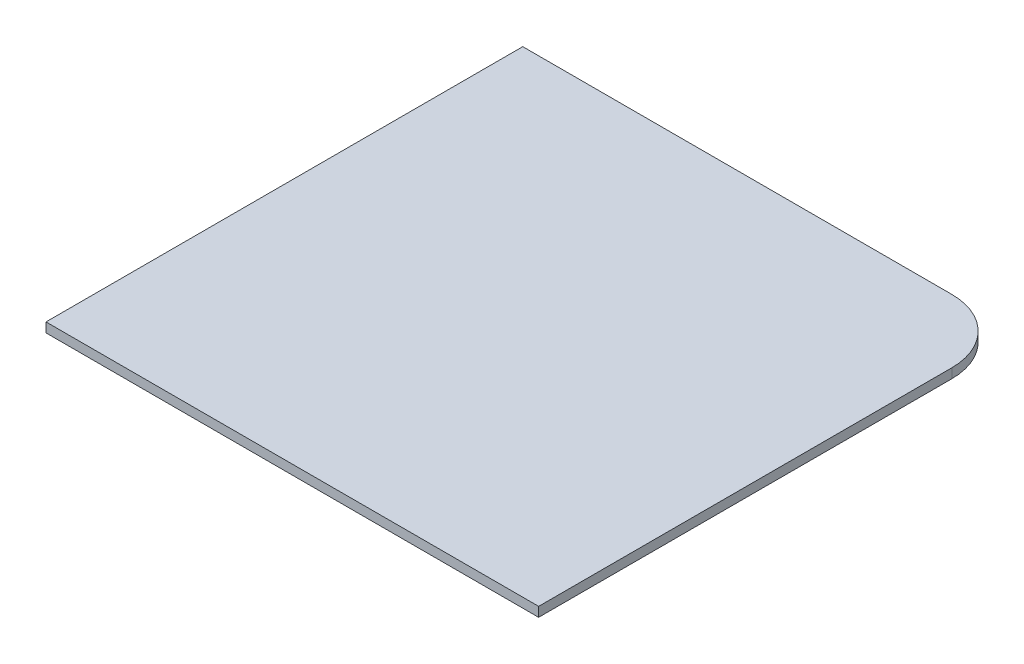
ISO-10303-21;
HEADER;
FILE_DESCRIPTION(('STEP AP214'),'2;1');
FILE_NAME('part.step','',(''),(''),'','','');
FILE_SCHEMA(('AUTOMOTIVE_DESIGN { 1 0 10303 214 1 1 1 1 }'));
ENDSEC;
DATA;
#1=APPLICATION_CONTEXT('core data for automotive mechanical design processes');
#2=APPLICATION_PROTOCOL_DEFINITION('international standard','automotive_design',2000,#1);
#3=PRODUCT_CONTEXT('',#1,'mechanical');
#4=PRODUCT('Part','Part','',(#3));
#5=PRODUCT_RELATED_PRODUCT_CATEGORY('part','',(#4));
#6=PRODUCT_DEFINITION_FORMATION('','',#4);
#7=PRODUCT_DEFINITION_CONTEXT('part definition',#1,'design');
#8=PRODUCT_DEFINITION('design','',#6,#7);
#9=PRODUCT_DEFINITION_SHAPE('','',#8);
#10=(LENGTH_UNIT() NAMED_UNIT(*) SI_UNIT(.MILLI.,.METRE.));
#11=(NAMED_UNIT(*) PLANE_ANGLE_UNIT() SI_UNIT($,.RADIAN.));
#12=(NAMED_UNIT(*) SI_UNIT($,.STERADIAN.) SOLID_ANGLE_UNIT());
#13=UNCERTAINTY_MEASURE_WITH_UNIT(LENGTH_MEASURE(1.E-05),#10,'distance_accuracy_value','');
#14=(GEOMETRIC_REPRESENTATION_CONTEXT(3) GLOBAL_UNCERTAINTY_ASSIGNED_CONTEXT((#13)) GLOBAL_UNIT_ASSIGNED_CONTEXT((#10,
#11,#12)) REPRESENTATION_CONTEXT('',''));
#15=CARTESIAN_POINT('',(0.,0.,0.));
#16=DIRECTION('',(0.,0.,1.));
#17=DIRECTION('',(1.,0.,0.));
#18=AXIS2_PLACEMENT_3D('',#15,#16,#17);
#19=CARTESIAN_POINT('',(57.5,3.,-75.));
#20=DIRECTION('',(0.,0.,1.));
#21=DIRECTION('',(1.,0.,0.));
#22=AXIS2_PLACEMENT_3D('',#19,#20,#21);
#23=PLANE('',#22);
#24=DIRECTION('',(-1.,0.,0.));
#25=VECTOR('',#24,1.);
#26=CARTESIAN_POINT('',(57.5,0.,-75.));
#27=LINE('',#26,#25);
#28=CARTESIAN_POINT('',(57.5,0.,-75.));
#29=VERTEX_POINT('',#28);
#30=CARTESIAN_POINT('',(-77.5,0.,-75.));
#31=VERTEX_POINT('',#30);
#32=EDGE_CURVE('E122',#29,#31,#27,.T.);
#33=ORIENTED_EDGE('',*,*,#32,.T.);
#34=DIRECTION('',(0.,-1.,0.));
#35=VECTOR('',#34,1.);
#36=CARTESIAN_POINT('',(-77.5,3.,-75.));
#37=LINE('',#36,#35);
#38=CARTESIAN_POINT('',(-77.5,3.,-75.));
#39=VERTEX_POINT('',#38);
#40=EDGE_CURVE('E11',#39,#31,#37,.T.);
#41=ORIENTED_EDGE('',*,*,#40,.F.);
#42=DIRECTION('',(-1.,0.,0.));
#43=VECTOR('',#42,1.);
#44=CARTESIAN_POINT('',(57.5,3.,-75.));
#45=LINE('',#44,#43);
#46=CARTESIAN_POINT('',(57.5,3.,-75.));
#47=VERTEX_POINT('',#46);
#48=EDGE_CURVE('E135',#47,#39,#45,.T.);
#49=ORIENTED_EDGE('',*,*,#48,.F.);
#50=DIRECTION('',(0.,-1.,0.));
#51=VECTOR('',#50,1.);
#52=CARTESIAN_POINT('',(57.5,3.,-75.));
#53=LINE('',#52,#51);
#54=EDGE_CURVE('E118',#47,#29,#53,.T.);
#55=ORIENTED_EDGE('',*,*,#54,.T.);
#56=EDGE_LOOP('',(#33,#41,#49,#55));
#57=FACE_BOUND('',#56,.T.);
#58=ADVANCED_FACE('F43',(#57),#23,.F.);
#59=CARTESIAN_POINT('',(-77.5,3.,-75.));
#60=DIRECTION('',(1.,0.,0.));
#61=DIRECTION('',(0.,0.,-1.));
#62=AXIS2_PLACEMENT_3D('',#59,#60,#61);
#63=PLANE('',#62);
#64=DIRECTION('',(0.,0.,1.));
#65=VECTOR('',#64,1.);
#66=CARTESIAN_POINT('',(-77.5,0.,-75.));
#67=LINE('',#66,#65);
#68=CARTESIAN_POINT('',(-77.5,0.,75.));
#69=VERTEX_POINT('',#68);
#70=EDGE_CURVE('E126',#31,#69,#67,.T.);
#71=ORIENTED_EDGE('',*,*,#70,.T.);
#72=DIRECTION('',(0.,-1.,0.));
#73=VECTOR('',#72,1.);
#74=CARTESIAN_POINT('',(-77.5,3.,75.));
#75=LINE('',#74,#73);
#76=CARTESIAN_POINT('',(-77.5,3.,75.));
#77=VERTEX_POINT('',#76);
#78=EDGE_CURVE('E52',#77,#69,#75,.T.);
#79=ORIENTED_EDGE('',*,*,#78,.F.);
#80=DIRECTION('',(0.,0.,1.));
#81=VECTOR('',#80,1.);
#82=CARTESIAN_POINT('',(-77.5,3.,-75.));
#83=LINE('',#82,#81);
#84=EDGE_CURVE('E94',#39,#77,#83,.T.);
#85=ORIENTED_EDGE('',*,*,#84,.F.);
#86=ORIENTED_EDGE('',*,*,#40,.T.);
#87=EDGE_LOOP('',(#71,#79,#85,#86));
#88=FACE_BOUND('',#87,.T.);
#89=ADVANCED_FACE('F157',(#88),#63,.F.);
#90=CARTESIAN_POINT('',(-77.5,3.,75.));
#91=DIRECTION('',(0.,0.,-1.));
#92=DIRECTION('',(-1.,0.,0.));
#93=AXIS2_PLACEMENT_3D('',#90,#91,#92);
#94=PLANE('',#93);
#95=DIRECTION('',(1.,0.,0.));
#96=VECTOR('',#95,1.);
#97=CARTESIAN_POINT('',(-77.5,0.,75.));
#98=LINE('',#97,#96);
#99=CARTESIAN_POINT('',(77.5,0.,75.));
#100=VERTEX_POINT('',#99);
#101=EDGE_CURVE('E110',#69,#100,#98,.T.);
#102=ORIENTED_EDGE('',*,*,#101,.T.);
#103=DIRECTION('',(0.,-1.,0.));
#104=VECTOR('',#103,1.);
#105=CARTESIAN_POINT('',(77.5,3.,75.));
#106=LINE('',#105,#104);
#107=CARTESIAN_POINT('',(77.5,3.,75.));
#108=VERTEX_POINT('',#107);
#109=EDGE_CURVE('E107',#108,#100,#106,.T.);
#110=ORIENTED_EDGE('',*,*,#109,.F.);
#111=DIRECTION('',(1.,0.,0.));
#112=VECTOR('',#111,1.);
#113=CARTESIAN_POINT('',(-77.5,3.,75.));
#114=LINE('',#113,#112);
#115=EDGE_CURVE('E98',#77,#108,#114,.T.);
#116=ORIENTED_EDGE('',*,*,#115,.F.);
#117=ORIENTED_EDGE('',*,*,#78,.T.);
#118=EDGE_LOOP('',(#102,#110,#116,#117));
#119=FACE_BOUND('',#118,.T.);
#120=ADVANCED_FACE('F108',(#119),#94,.F.);
#121=CARTESIAN_POINT('',(77.5,3.,75.));
#122=DIRECTION('',(-1.,0.,0.));
#123=DIRECTION('',(0.,0.,1.));
#124=AXIS2_PLACEMENT_3D('',#121,#122,#123);
#125=PLANE('',#124);
#126=DIRECTION('',(0.,0.,-1.));
#127=VECTOR('',#126,1.);
#128=CARTESIAN_POINT('',(77.5,0.,75.));
#129=LINE('',#128,#127);
#130=CARTESIAN_POINT('',(77.5,0.,-55.));
#131=VERTEX_POINT('',#130);
#132=EDGE_CURVE('E80',#100,#131,#129,.T.);
#133=ORIENTED_EDGE('',*,*,#132,.T.);
#134=DIRECTION('',(0.,-1.,0.));
#135=VECTOR('',#134,1.);
#136=CARTESIAN_POINT('',(77.5,3.,-55.));
#137=LINE('',#136,#135);
#138=CARTESIAN_POINT('',(77.5,3.,-55.));
#139=VERTEX_POINT('',#138);
#140=EDGE_CURVE('E112',#139,#131,#137,.T.);
#141=ORIENTED_EDGE('',*,*,#140,.F.);
#142=DIRECTION('',(0.,0.,-1.));
#143=VECTOR('',#142,1.);
#144=CARTESIAN_POINT('',(77.5,3.,75.));
#145=LINE('',#144,#143);
#146=EDGE_CURVE('E102',#108,#139,#145,.T.);
#147=ORIENTED_EDGE('',*,*,#146,.F.);
#148=ORIENTED_EDGE('',*,*,#109,.T.);
#149=EDGE_LOOP('',(#133,#141,#147,#148));
#150=FACE_BOUND('',#149,.T.);
#151=ADVANCED_FACE('F114',(#150),#125,.F.);
#152=CARTESIAN_POINT('',(57.5,3.,-55.));
#153=DIRECTION('',(0.,-1.,0.));
#154=DIRECTION('',(0.,0.,-1.));
#155=AXIS2_PLACEMENT_3D('',#152,#153,#154);
#156=CYLINDRICAL_SURFACE('',#155,20.);
#157=CARTESIAN_POINT('',(57.5,0.,-55.));
#158=DIRECTION('',(0.,1.,0.));
#159=DIRECTION('',(0.,0.,1.));
#160=AXIS2_PLACEMENT_3D('',#157,#158,#159);
#161=CIRCLE('',#160,20.);
#162=EDGE_CURVE('E86',#131,#29,#161,.T.);
#163=ORIENTED_EDGE('',*,*,#162,.T.);
#164=ORIENTED_EDGE('',*,*,#54,.F.);
#165=CARTESIAN_POINT('',(57.5,3.,-55.));
#166=DIRECTION('',(0.,1.,0.));
#167=DIRECTION('',(0.,0.,1.));
#168=AXIS2_PLACEMENT_3D('',#165,#166,#167);
#169=CIRCLE('',#168,20.);
#170=EDGE_CURVE('E60',#139,#47,#169,.T.);
#171=ORIENTED_EDGE('',*,*,#170,.F.);
#172=ORIENTED_EDGE('',*,*,#140,.T.);
#173=EDGE_LOOP('',(#163,#164,#171,#172));
#174=FACE_BOUND('',#173,.T.);
#175=ADVANCED_FACE('F146',(#174),#156,.T.);
#176=CARTESIAN_POINT('',(57.5,3.,-55.));
#177=DIRECTION('',(0.,1.,0.));
#178=DIRECTION('',(0.,0.,1.));
#179=AXIS2_PLACEMENT_3D('',#176,#177,#178);
#180=PLANE('',#179);
#181=ORIENTED_EDGE('',*,*,#48,.T.);
#182=ORIENTED_EDGE('',*,*,#84,.T.);
#183=ORIENTED_EDGE('',*,*,#115,.T.);
#184=ORIENTED_EDGE('',*,*,#146,.T.);
#185=ORIENTED_EDGE('',*,*,#170,.T.);
#186=EDGE_LOOP('',(#181,#182,#183,#184,#185));
#187=FACE_BOUND('',#186,.T.);
#188=ADVANCED_FACE('F100',(#187),#180,.T.);
#189=CARTESIAN_POINT('',(57.5,0.,-55.));
#190=DIRECTION('',(0.,1.,0.));
#191=DIRECTION('',(0.,0.,1.));
#192=AXIS2_PLACEMENT_3D('',#189,#190,#191);
#193=PLANE('',#192);
#194=ORIENTED_EDGE('',*,*,#32,.F.);
#195=ORIENTED_EDGE('',*,*,#162,.F.);
#196=ORIENTED_EDGE('',*,*,#132,.F.);
#197=ORIENTED_EDGE('',*,*,#101,.F.);
#198=ORIENTED_EDGE('',*,*,#70,.F.);
#199=EDGE_LOOP('',(#194,#195,#196,#197,#198));
#200=FACE_BOUND('',#199,.T.);
#201=ADVANCED_FACE('F142',(#200),#193,.F.);
#202=CLOSED_SHELL('',(#58,#89,#120,#151,#175,#188,#201));
#203=MANIFOLD_SOLID_BREP('B2',#202);
#204=ADVANCED_BREP_SHAPE_REPRESENTATION('',(#18,#203),#14);
#205=SHAPE_DEFINITION_REPRESENTATION(#9,#204);
ENDSEC;
END-ISO-10303-21;
